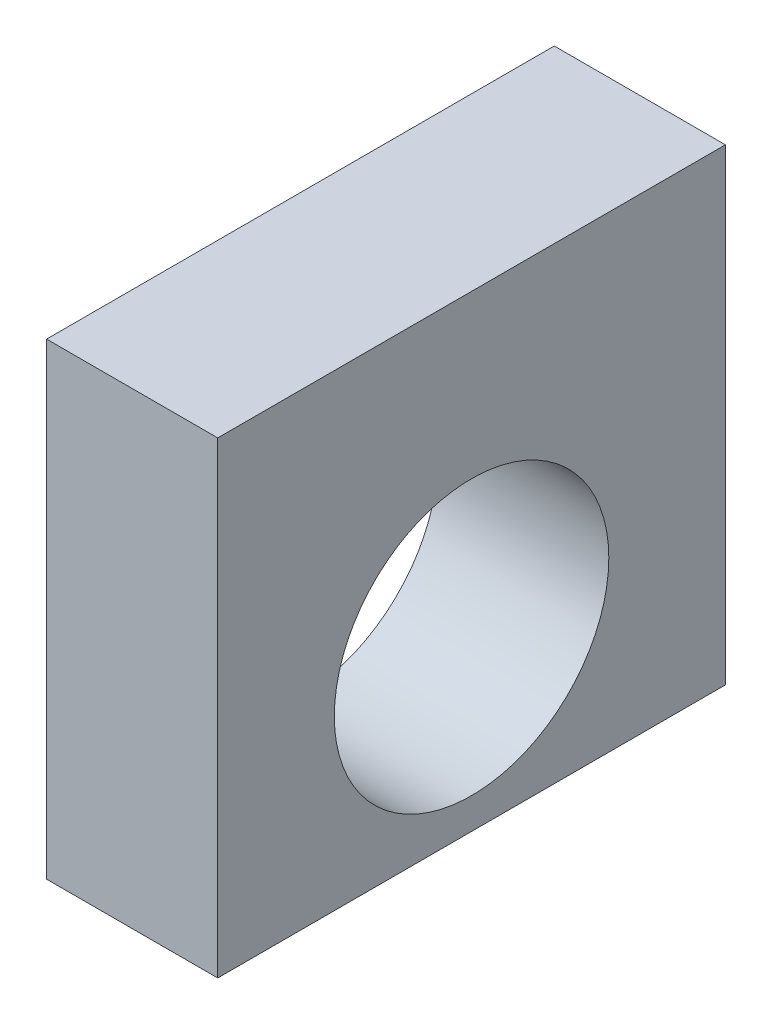
ISO-10303-21;
HEADER;
FILE_DESCRIPTION(('STEP AP214'),'2;1');
FILE_NAME('part.step','',(''),(''),'','','');
FILE_SCHEMA(('AUTOMOTIVE_DESIGN { 1 0 10303 214 1 1 1 1 }'));
ENDSEC;
DATA;
#1=APPLICATION_CONTEXT('core data for automotive mechanical design processes');
#2=APPLICATION_PROTOCOL_DEFINITION('international standard','automotive_design',2000,#1);
#3=PRODUCT_CONTEXT('',#1,'mechanical');
#4=PRODUCT('Part','Part','',(#3));
#5=PRODUCT_RELATED_PRODUCT_CATEGORY('part','',(#4));
#6=PRODUCT_DEFINITION_FORMATION('','',#4);
#7=PRODUCT_DEFINITION_CONTEXT('part definition',#1,'design');
#8=PRODUCT_DEFINITION('design','',#6,#7);
#9=PRODUCT_DEFINITION_SHAPE('','',#8);
#10=(LENGTH_UNIT() NAMED_UNIT(*) SI_UNIT(.MILLI.,.METRE.));
#11=(NAMED_UNIT(*) PLANE_ANGLE_UNIT() SI_UNIT($,.RADIAN.));
#12=(NAMED_UNIT(*) SI_UNIT($,.STERADIAN.) SOLID_ANGLE_UNIT());
#13=UNCERTAINTY_MEASURE_WITH_UNIT(LENGTH_MEASURE(1.E-05),#10,'distance_accuracy_value','');
#14=(GEOMETRIC_REPRESENTATION_CONTEXT(3) GLOBAL_UNCERTAINTY_ASSIGNED_CONTEXT((#13)) GLOBAL_UNIT_ASSIGNED_CONTEXT((#10,
#11,#12)) REPRESENTATION_CONTEXT('',''));
#15=CARTESIAN_POINT('',(0.,0.,0.));
#16=DIRECTION('',(0.,0.,1.));
#17=DIRECTION('',(1.,0.,0.));
#18=AXIS2_PLACEMENT_3D('',#15,#16,#17);
#19=CARTESIAN_POINT('',(3.,98.5,-8.9));
#20=DIRECTION('',(0.,0.,1.));
#21=DIRECTION('',(1.,0.,0.));
#22=AXIS2_PLACEMENT_3D('',#19,#20,#21);
#23=PLANE('',#22);
#24=DIRECTION('',(0.,1.,0.));
#25=VECTOR('',#24,1.);
#26=CARTESIAN_POINT('',(-3.,98.5,-8.9));
#27=LINE('',#26,#25);
#28=CARTESIAN_POINT('',(-3.,82.1,-8.9));
#29=VERTEX_POINT('',#28);
#30=CARTESIAN_POINT('',(-3.,98.5,-8.9));
#31=VERTEX_POINT('',#30);
#32=EDGE_CURVE('E106',#29,#31,#27,.T.);
#33=ORIENTED_EDGE('',*,*,#32,.T.);
#34=DIRECTION('',(-1.,0.,0.));
#35=VECTOR('',#34,1.);
#36=CARTESIAN_POINT('',(3.,98.5,-8.9));
#37=LINE('',#36,#35);
#38=CARTESIAN_POINT('',(3.,98.5,-8.9));
#39=VERTEX_POINT('',#38);
#40=EDGE_CURVE('E11',#39,#31,#37,.T.);
#41=ORIENTED_EDGE('',*,*,#40,.F.);
#42=DIRECTION('',(0.,1.,0.));
#43=VECTOR('',#42,1.);
#44=CARTESIAN_POINT('',(3.,98.5,-8.9));
#45=LINE('',#44,#43);
#46=CARTESIAN_POINT('',(3.,82.1,-8.9));
#47=VERTEX_POINT('',#46);
#48=EDGE_CURVE('E91',#47,#39,#45,.T.);
#49=ORIENTED_EDGE('',*,*,#48,.F.);
#50=DIRECTION('',(-1.,0.,0.));
#51=VECTOR('',#50,1.);
#52=CARTESIAN_POINT('',(3.,82.1,-8.9));
#53=LINE('',#52,#51);
#54=EDGE_CURVE('E105',#47,#29,#53,.T.);
#55=ORIENTED_EDGE('',*,*,#54,.T.);
#56=EDGE_LOOP('',(#33,#41,#49,#55));
#57=FACE_BOUND('',#56,.T.);
#58=ADVANCED_FACE('F41',(#57),#23,.F.);
#59=CARTESIAN_POINT('',(3.,98.5,8.9));
#60=DIRECTION('',(0.,-1.,0.));
#61=DIRECTION('',(0.,0.,-1.));
#62=AXIS2_PLACEMENT_3D('',#59,#60,#61);
#63=PLANE('',#62);
#64=DIRECTION('',(0.,0.,1.));
#65=VECTOR('',#64,1.);
#66=CARTESIAN_POINT('',(-3.,98.5,8.9));
#67=LINE('',#66,#65);
#68=CARTESIAN_POINT('',(-3.,98.5,8.9));
#69=VERTEX_POINT('',#68);
#70=EDGE_CURVE('E100',#31,#69,#67,.T.);
#71=ORIENTED_EDGE('',*,*,#70,.T.);
#72=DIRECTION('',(-1.,0.,0.));
#73=VECTOR('',#72,1.);
#74=CARTESIAN_POINT('',(3.,98.5,8.9));
#75=LINE('',#74,#73);
#76=CARTESIAN_POINT('',(3.,98.5,8.9));
#77=VERTEX_POINT('',#76);
#78=EDGE_CURVE('E49',#77,#69,#75,.T.);
#79=ORIENTED_EDGE('',*,*,#78,.F.);
#80=DIRECTION('',(0.,0.,1.));
#81=VECTOR('',#80,1.);
#82=CARTESIAN_POINT('',(3.,98.5,8.9));
#83=LINE('',#82,#81);
#84=EDGE_CURVE('E86',#39,#77,#83,.T.);
#85=ORIENTED_EDGE('',*,*,#84,.F.);
#86=ORIENTED_EDGE('',*,*,#40,.T.);
#87=EDGE_LOOP('',(#71,#79,#85,#86));
#88=FACE_BOUND('',#87,.T.);
#89=ADVANCED_FACE('F96',(#88),#63,.F.);
#90=CARTESIAN_POINT('',(3.,82.1,8.9));
#91=DIRECTION('',(0.,0.,-1.));
#92=DIRECTION('',(-1.,0.,0.));
#93=AXIS2_PLACEMENT_3D('',#90,#91,#92);
#94=PLANE('',#93);
#95=DIRECTION('',(0.,-1.,0.));
#96=VECTOR('',#95,1.);
#97=CARTESIAN_POINT('',(-3.,82.1,8.9));
#98=LINE('',#97,#96);
#99=CARTESIAN_POINT('',(-3.,82.1,8.9));
#100=VERTEX_POINT('',#99);
#101=EDGE_CURVE('E73',#69,#100,#98,.T.);
#102=ORIENTED_EDGE('',*,*,#101,.T.);
#103=DIRECTION('',(-1.,0.,0.));
#104=VECTOR('',#103,1.);
#105=CARTESIAN_POINT('',(3.,82.1,8.9));
#106=LINE('',#105,#104);
#107=CARTESIAN_POINT('',(3.,82.1,8.9));
#108=VERTEX_POINT('',#107);
#109=EDGE_CURVE('E98',#108,#100,#106,.T.);
#110=ORIENTED_EDGE('',*,*,#109,.F.);
#111=DIRECTION('',(0.,-1.,0.));
#112=VECTOR('',#111,1.);
#113=CARTESIAN_POINT('',(3.,82.1,8.9));
#114=LINE('',#113,#112);
#115=EDGE_CURVE('E93',#77,#108,#114,.T.);
#116=ORIENTED_EDGE('',*,*,#115,.F.);
#117=ORIENTED_EDGE('',*,*,#78,.T.);
#118=EDGE_LOOP('',(#102,#110,#116,#117));
#119=FACE_BOUND('',#118,.T.);
#120=ADVANCED_FACE('F99',(#119),#94,.F.);
#121=CARTESIAN_POINT('',(3.,82.1,-8.9));
#122=DIRECTION('',(0.,1.,0.));
#123=DIRECTION('',(0.,0.,1.));
#124=AXIS2_PLACEMENT_3D('',#121,#122,#123);
#125=PLANE('',#124);
#126=DIRECTION('',(0.,0.,-1.));
#127=VECTOR('',#126,1.);
#128=CARTESIAN_POINT('',(-3.,82.1,-8.9));
#129=LINE('',#128,#127);
#130=EDGE_CURVE('E84',#100,#29,#129,.T.);
#131=ORIENTED_EDGE('',*,*,#130,.T.);
#132=ORIENTED_EDGE('',*,*,#54,.F.);
#133=DIRECTION('',(0.,0.,-1.));
#134=VECTOR('',#133,1.);
#135=CARTESIAN_POINT('',(3.,82.1,-8.9));
#136=LINE('',#135,#134);
#137=EDGE_CURVE('E59',#108,#47,#136,.T.);
#138=ORIENTED_EDGE('',*,*,#137,.F.);
#139=ORIENTED_EDGE('',*,*,#109,.T.);
#140=EDGE_LOOP('',(#131,#132,#138,#139));
#141=FACE_BOUND('',#140,.T.);
#142=ADVANCED_FACE('F111',(#141),#125,.F.);
#143=CARTESIAN_POINT('',(3.,0.,0.));
#144=DIRECTION('',(-1.,0.,0.));
#145=DIRECTION('',(0.,0.,1.));
#146=AXIS2_PLACEMENT_3D('',#143,#144,#145);
#147=PLANE('',#146);
#148=CARTESIAN_POINT('',(3.,88.,0.));
#149=DIRECTION('',(-1.,0.,0.));
#150=DIRECTION('',(0.,0.,1.));
#151=AXIS2_PLACEMENT_3D('',#148,#149,#150);
#152=CIRCLE('',#151,4.8125);
#153=CARTESIAN_POINT('',(3.,88.,4.8125));
#154=VERTEX_POINT('',#153);
#155=EDGE_CURVE('E108',#154,#154,#152,.T.);
#156=ORIENTED_EDGE('',*,*,#155,.T.);
#157=EDGE_LOOP('',(#156));
#158=FACE_BOUND('',#157,.T.);
#159=ORIENTED_EDGE('',*,*,#48,.T.);
#160=ORIENTED_EDGE('',*,*,#84,.T.);
#161=ORIENTED_EDGE('',*,*,#115,.T.);
#162=ORIENTED_EDGE('',*,*,#137,.T.);
#163=EDGE_LOOP('',(#159,#160,#161,#162));
#164=FACE_BOUND('',#163,.T.);
#165=ADVANCED_FACE('F90',(#158,#164),#147,.F.);
#166=CARTESIAN_POINT('',(-3.,0.,0.));
#167=DIRECTION('',(-1.,0.,0.));
#168=DIRECTION('',(0.,0.,1.));
#169=AXIS2_PLACEMENT_3D('',#166,#167,#168);
#170=PLANE('',#169);
#171=CARTESIAN_POINT('',(-3.,88.,0.));
#172=DIRECTION('',(-1.,0.,0.));
#173=DIRECTION('',(0.,0.,1.));
#174=AXIS2_PLACEMENT_3D('',#171,#172,#173);
#175=CIRCLE('',#174,4.8125);
#176=CARTESIAN_POINT('',(-3.,88.,4.8125));
#177=VERTEX_POINT('',#176);
#178=EDGE_CURVE('E42',#177,#177,#175,.T.);
#179=ORIENTED_EDGE('',*,*,#178,.F.);
#180=EDGE_LOOP('',(#179));
#181=FACE_BOUND('',#180,.T.);
#182=ORIENTED_EDGE('',*,*,#32,.F.);
#183=ORIENTED_EDGE('',*,*,#130,.F.);
#184=ORIENTED_EDGE('',*,*,#101,.F.);
#185=ORIENTED_EDGE('',*,*,#70,.F.);
#186=EDGE_LOOP('',(#182,#183,#184,#185));
#187=FACE_BOUND('',#186,.T.);
#188=ADVANCED_FACE('F120',(#181,#187),#170,.T.);
#189=CARTESIAN_POINT('',(-4.,88.,0.));
#190=DIRECTION('',(1.,0.,0.));
#191=DIRECTION('',(0.,0.,-1.));
#192=AXIS2_PLACEMENT_3D('',#189,#190,#191);
#193=CYLINDRICAL_SURFACE('',#192,4.8125);
#194=ORIENTED_EDGE('',*,*,#178,.T.);
#195=EDGE_LOOP('',(#194));
#196=FACE_BOUND('',#195,.T.);
#197=ORIENTED_EDGE('',*,*,#155,.F.);
#198=EDGE_LOOP('',(#197));
#199=FACE_BOUND('',#198,.T.);
#200=ADVANCED_FACE('F127',(#196,#199),#193,.F.);
#201=CLOSED_SHELL('',(#58,#89,#120,#142,#165,#188,#200));
#202=MANIFOLD_SOLID_BREP('B2',#201);
#203=ADVANCED_BREP_SHAPE_REPRESENTATION('',(#18,#202),#14);
#204=SHAPE_DEFINITION_REPRESENTATION(#9,#203);
ENDSEC;
END-ISO-10303-21;
